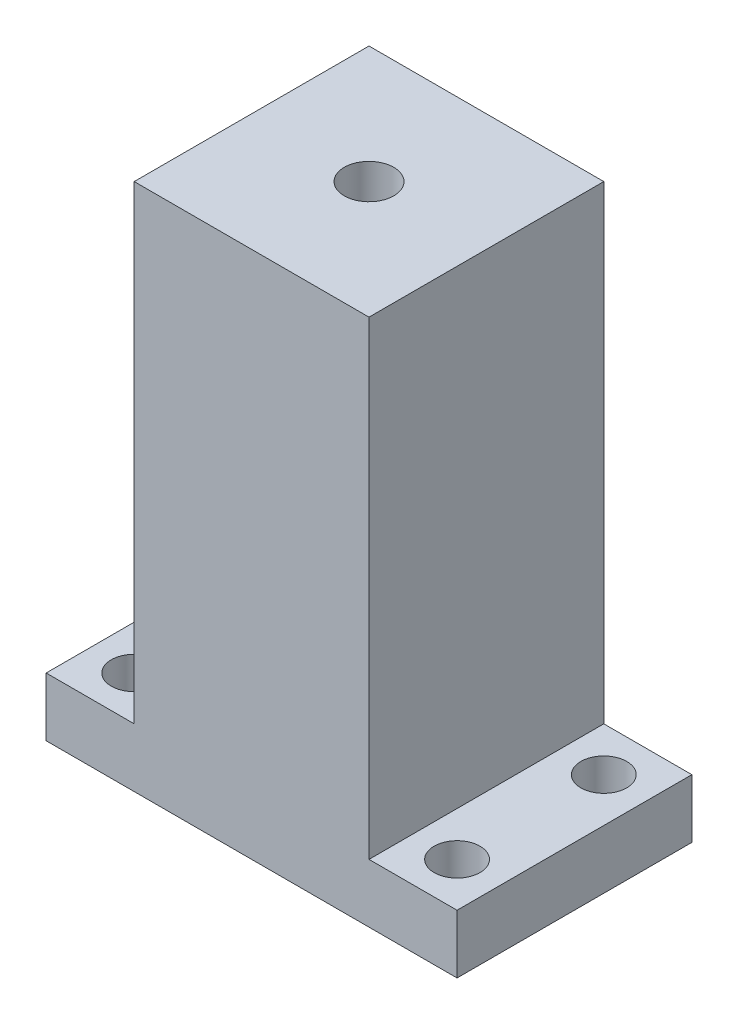
ISO-10303-21;
HEADER;
FILE_DESCRIPTION(('STEP AP214'),'2;1');
FILE_NAME('part.step','',(''),(''),'','','');
FILE_SCHEMA(('AUTOMOTIVE_DESIGN { 1 0 10303 214 1 1 1 1 }'));
ENDSEC;
DATA;
#1=APPLICATION_CONTEXT('core data for automotive mechanical design processes');
#2=APPLICATION_PROTOCOL_DEFINITION('international standard','automotive_design',2000,#1);
#3=PRODUCT_CONTEXT('',#1,'mechanical');
#4=PRODUCT('Part','Part','',(#3));
#5=PRODUCT_RELATED_PRODUCT_CATEGORY('part','',(#4));
#6=PRODUCT_DEFINITION_FORMATION('','',#4);
#7=PRODUCT_DEFINITION_CONTEXT('part definition',#1,'design');
#8=PRODUCT_DEFINITION('design','',#6,#7);
#9=PRODUCT_DEFINITION_SHAPE('','',#8);
#10=(LENGTH_UNIT() NAMED_UNIT(*) SI_UNIT(.MILLI.,.METRE.));
#11=(NAMED_UNIT(*) PLANE_ANGLE_UNIT() SI_UNIT($,.RADIAN.));
#12=(NAMED_UNIT(*) SI_UNIT($,.STERADIAN.) SOLID_ANGLE_UNIT());
#13=UNCERTAINTY_MEASURE_WITH_UNIT(LENGTH_MEASURE(1.E-05),#10,'distance_accuracy_value','');
#14=(GEOMETRIC_REPRESENTATION_CONTEXT(3) GLOBAL_UNCERTAINTY_ASSIGNED_CONTEXT((#13)) GLOBAL_UNIT_ASSIGNED_CONTEXT((#10,
#11,#12)) REPRESENTATION_CONTEXT('',''));
#15=CARTESIAN_POINT('',(0.,0.,0.));
#16=DIRECTION('',(0.,0.,1.));
#17=DIRECTION('',(1.,0.,0.));
#18=AXIS2_PLACEMENT_3D('',#15,#16,#17);
#19=CARTESIAN_POINT('',(44.45,114.3,25.4));
#20=DIRECTION('',(-1.,0.,0.));
#21=DIRECTION('',(0.,0.,1.));
#22=AXIS2_PLACEMENT_3D('',#19,#20,#21);
#23=PLANE('',#22);
#24=DIRECTION('',(0.,0.,-1.));
#25=VECTOR('',#24,1.);
#26=CARTESIAN_POINT('',(44.45,12.7,25.4));
#27=LINE('',#26,#25);
#28=CARTESIAN_POINT('',(44.45,12.7,25.4));
#29=VERTEX_POINT('',#28);
#30=CARTESIAN_POINT('',(44.45,12.7,-25.4));
#31=VERTEX_POINT('',#30);
#32=EDGE_CURVE('E103',#29,#31,#27,.T.);
#33=ORIENTED_EDGE('',*,*,#32,.F.);
#34=DIRECTION('',(0.,-1.,0.));
#35=VECTOR('',#34,1.);
#36=CARTESIAN_POINT('',(44.45,114.3,25.4));
#37=LINE('',#36,#35);
#38=CARTESIAN_POINT('',(44.45,0.,25.4));
#39=VERTEX_POINT('',#38);
#40=EDGE_CURVE('E133',#29,#39,#37,.T.);
#41=ORIENTED_EDGE('',*,*,#40,.T.);
#42=DIRECTION('',(0.,0.,-1.));
#43=VECTOR('',#42,1.);
#44=CARTESIAN_POINT('',(44.45,0.,25.4));
#45=LINE('',#44,#43);
#46=CARTESIAN_POINT('',(44.45,0.,-25.4));
#47=VERTEX_POINT('',#46);
#48=EDGE_CURVE('E134',#39,#47,#45,.T.);
#49=ORIENTED_EDGE('',*,*,#48,.T.);
#50=DIRECTION('',(0.,-1.,0.));
#51=VECTOR('',#50,1.);
#52=CARTESIAN_POINT('',(44.45,114.3,-25.4));
#53=LINE('',#52,#51);
#54=EDGE_CURVE('E149',#31,#47,#53,.T.);
#55=ORIENTED_EDGE('',*,*,#54,.F.);
#56=EDGE_LOOP('',(#33,#41,#49,#55));
#57=FACE_BOUND('',#56,.T.);
#58=ADVANCED_FACE('F33',(#57),#23,.F.);
#59=CARTESIAN_POINT('',(-44.45,114.3,-25.4));
#60=DIRECTION('',(0.,0.,1.));
#61=DIRECTION('',(1.,0.,0.));
#62=AXIS2_PLACEMENT_3D('',#59,#60,#61);
#63=PLANE('',#62);
#64=DIRECTION('',(0.,1.,0.));
#65=VECTOR('',#64,1.);
#66=CARTESIAN_POINT('',(25.4,12.7,-25.4));
#67=LINE('',#66,#65);
#68=CARTESIAN_POINT('',(25.4,12.7,-25.4));
#69=VERTEX_POINT('',#68);
#70=CARTESIAN_POINT('',(25.4,114.3,-25.4));
#71=VERTEX_POINT('',#70);
#72=EDGE_CURVE('E55',#69,#71,#67,.T.);
#73=ORIENTED_EDGE('',*,*,#72,.F.);
#74=DIRECTION('',(-1.,0.,0.));
#75=VECTOR('',#74,1.);
#76=CARTESIAN_POINT('',(-44.45,12.7,-25.4));
#77=LINE('',#76,#75);
#78=EDGE_CURVE('E98',#31,#69,#77,.T.);
#79=ORIENTED_EDGE('',*,*,#78,.F.);
#80=ORIENTED_EDGE('',*,*,#54,.T.);
#81=DIRECTION('',(-1.,0.,0.));
#82=VECTOR('',#81,1.);
#83=CARTESIAN_POINT('',(-44.45,0.,-25.4));
#84=LINE('',#83,#82);
#85=CARTESIAN_POINT('',(-44.45,0.,-25.4));
#86=VERTEX_POINT('',#85);
#87=EDGE_CURVE('E137',#47,#86,#84,.T.);
#88=ORIENTED_EDGE('',*,*,#87,.T.);
#89=DIRECTION('',(0.,-1.,0.));
#90=VECTOR('',#89,1.);
#91=CARTESIAN_POINT('',(-44.45,114.3,-25.4));
#92=LINE('',#91,#90);
#93=CARTESIAN_POINT('',(-44.45,12.7,-25.4));
#94=VERTEX_POINT('',#93);
#95=EDGE_CURVE('E148',#94,#86,#92,.T.);
#96=ORIENTED_EDGE('',*,*,#95,.F.);
#97=CARTESIAN_POINT('',(-25.4,12.7,-25.4));
#98=VERTEX_POINT('',#97);
#99=EDGE_CURVE('E108',#98,#94,#77,.T.);
#100=ORIENTED_EDGE('',*,*,#99,.F.);
#101=DIRECTION('',(0.,1.,0.));
#102=VECTOR('',#101,1.);
#103=CARTESIAN_POINT('',(-25.4,12.7,-25.4));
#104=LINE('',#103,#102);
#105=CARTESIAN_POINT('',(-25.4,114.3,-25.4));
#106=VERTEX_POINT('',#105);
#107=EDGE_CURVE('E120',#98,#106,#104,.T.);
#108=ORIENTED_EDGE('',*,*,#107,.T.);
#109=DIRECTION('',(-1.,0.,0.));
#110=VECTOR('',#109,1.);
#111=CARTESIAN_POINT('',(-44.45,114.3,-25.4));
#112=LINE('',#111,#110);
#113=EDGE_CURVE('E119',#71,#106,#112,.T.);
#114=ORIENTED_EDGE('',*,*,#113,.F.);
#115=EDGE_LOOP('',(#73,#79,#80,#88,#96,#100,#108,#114));
#116=FACE_BOUND('',#115,.T.);
#117=ADVANCED_FACE('F116',(#116),#63,.F.);
#118=CARTESIAN_POINT('',(-44.45,114.3,25.4));
#119=DIRECTION('',(1.,0.,0.));
#120=DIRECTION('',(0.,0.,-1.));
#121=AXIS2_PLACEMENT_3D('',#118,#119,#120);
#122=PLANE('',#121);
#123=DIRECTION('',(0.,0.,1.));
#124=VECTOR('',#123,1.);
#125=CARTESIAN_POINT('',(-44.45,12.7,25.4));
#126=LINE('',#125,#124);
#127=CARTESIAN_POINT('',(-44.45,12.7,25.4));
#128=VERTEX_POINT('',#127);
#129=EDGE_CURVE('E106',#94,#128,#126,.T.);
#130=ORIENTED_EDGE('',*,*,#129,.F.);
#131=ORIENTED_EDGE('',*,*,#95,.T.);
#132=DIRECTION('',(0.,0.,1.));
#133=VECTOR('',#132,1.);
#134=CARTESIAN_POINT('',(-44.45,0.,25.4));
#135=LINE('',#134,#133);
#136=CARTESIAN_POINT('',(-44.45,0.,25.4));
#137=VERTEX_POINT('',#136);
#138=EDGE_CURVE('E140',#86,#137,#135,.T.);
#139=ORIENTED_EDGE('',*,*,#138,.T.);
#140=DIRECTION('',(0.,-1.,0.));
#141=VECTOR('',#140,1.);
#142=CARTESIAN_POINT('',(-44.45,114.3,25.4));
#143=LINE('',#142,#141);
#144=EDGE_CURVE('E146',#128,#137,#143,.T.);
#145=ORIENTED_EDGE('',*,*,#144,.F.);
#146=EDGE_LOOP('',(#130,#131,#139,#145));
#147=FACE_BOUND('',#146,.T.);
#148=ADVANCED_FACE('F166',(#147),#122,.F.);
#149=CARTESIAN_POINT('',(-44.45,114.3,25.4));
#150=DIRECTION('',(0.,0.,-1.));
#151=DIRECTION('',(-1.,0.,0.));
#152=AXIS2_PLACEMENT_3D('',#149,#150,#151);
#153=PLANE('',#152);
#154=DIRECTION('',(0.,1.,0.));
#155=VECTOR('',#154,1.);
#156=CARTESIAN_POINT('',(25.4,12.7,25.4));
#157=LINE('',#156,#155);
#158=CARTESIAN_POINT('',(25.4,12.7,25.4));
#159=VERTEX_POINT('',#158);
#160=CARTESIAN_POINT('',(25.4,114.3,25.4));
#161=VERTEX_POINT('',#160);
#162=EDGE_CURVE('E111',#159,#161,#157,.T.);
#163=ORIENTED_EDGE('',*,*,#162,.T.);
#164=DIRECTION('',(1.,0.,0.));
#165=VECTOR('',#164,1.);
#166=CARTESIAN_POINT('',(-44.45,114.3,25.4));
#167=LINE('',#166,#165);
#168=CARTESIAN_POINT('',(-25.4,114.3,25.4));
#169=VERTEX_POINT('',#168);
#170=EDGE_CURVE('E129',#169,#161,#167,.T.);
#171=ORIENTED_EDGE('',*,*,#170,.F.);
#172=DIRECTION('',(0.,1.,0.));
#173=VECTOR('',#172,1.);
#174=CARTESIAN_POINT('',(-25.4,12.7,25.4));
#175=LINE('',#174,#173);
#176=CARTESIAN_POINT('',(-25.4,12.7,25.4));
#177=VERTEX_POINT('',#176);
#178=EDGE_CURVE('E47',#177,#169,#175,.T.);
#179=ORIENTED_EDGE('',*,*,#178,.F.);
#180=DIRECTION('',(1.,0.,0.));
#181=VECTOR('',#180,1.);
#182=CARTESIAN_POINT('',(-44.45,12.7,25.4));
#183=LINE('',#182,#181);
#184=EDGE_CURVE('E12',#128,#177,#183,.T.);
#185=ORIENTED_EDGE('',*,*,#184,.F.);
#186=ORIENTED_EDGE('',*,*,#144,.T.);
#187=DIRECTION('',(1.,0.,0.));
#188=VECTOR('',#187,1.);
#189=CARTESIAN_POINT('',(-44.45,0.,25.4));
#190=LINE('',#189,#188);
#191=EDGE_CURVE('E130',#137,#39,#190,.T.);
#192=ORIENTED_EDGE('',*,*,#191,.T.);
#193=ORIENTED_EDGE('',*,*,#40,.F.);
#194=EDGE_CURVE('E40',#159,#29,#183,.T.);
#195=ORIENTED_EDGE('',*,*,#194,.F.);
#196=EDGE_LOOP('',(#163,#171,#179,#185,#186,#192,#193,#195));
#197=FACE_BOUND('',#196,.T.);
#198=ADVANCED_FACE('F154',(#197),#153,.F.);
#199=CARTESIAN_POINT('',(0.,114.3,0.));
#200=DIRECTION('',(0.,-1.,0.));
#201=DIRECTION('',(0.,0.,-1.));
#202=AXIS2_PLACEMENT_3D('',#199,#200,#201);
#203=PLANE('',#202);
#204=CARTESIAN_POINT('',(0.,114.3,0.));
#205=DIRECTION('',(0.,1.,0.));
#206=DIRECTION('',(0.,0.,1.));
#207=AXIS2_PLACEMENT_3D('',#204,#205,#206);
#208=CIRCLE('',#207,5.3578125);
#209=CARTESIAN_POINT('',(0.,114.3,5.3578125));
#210=VERTEX_POINT('',#209);
#211=EDGE_CURVE('E200',#210,#210,#208,.T.);
#212=ORIENTED_EDGE('',*,*,#211,.F.);
#213=EDGE_LOOP('',(#212));
#214=FACE_BOUND('',#213,.T.);
#215=DIRECTION('',(0.,0.,-1.));
#216=VECTOR('',#215,1.);
#217=CARTESIAN_POINT('',(25.4,114.3,25.4));
#218=LINE('',#217,#216);
#219=EDGE_CURVE('E173',#161,#71,#218,.T.);
#220=ORIENTED_EDGE('',*,*,#219,.T.);
#221=ORIENTED_EDGE('',*,*,#113,.T.);
#222=DIRECTION('',(0.,0.,1.));
#223=VECTOR('',#222,1.);
#224=CARTESIAN_POINT('',(-25.4,114.3,25.4));
#225=LINE('',#224,#223);
#226=EDGE_CURVE('E113',#106,#169,#225,.T.);
#227=ORIENTED_EDGE('',*,*,#226,.T.);
#228=ORIENTED_EDGE('',*,*,#170,.T.);
#229=EDGE_LOOP('',(#220,#221,#227,#228));
#230=FACE_BOUND('',#229,.T.);
#231=ADVANCED_FACE('F224',(#214,#230),#203,.F.);
#232=CARTESIAN_POINT('',(0.,0.,0.));
#233=DIRECTION('',(0.,-1.,0.));
#234=DIRECTION('',(0.,0.,-1.));
#235=AXIS2_PLACEMENT_3D('',#232,#233,#234);
#236=PLANE('',#235);
#237=CARTESIAN_POINT('',(0.,0.,0.));
#238=DIRECTION('',(0.,-1.,0.));
#239=DIRECTION('',(0.,0.,-1.));
#240=AXIS2_PLACEMENT_3D('',#237,#238,#239);
#241=CIRCLE('',#240,2.54);
#242=CARTESIAN_POINT('',(0.,0.,-2.54));
#243=VERTEX_POINT('',#242);
#244=EDGE_CURVE('E206',#243,#243,#241,.T.);
#245=ORIENTED_EDGE('',*,*,#244,.F.);
#246=EDGE_LOOP('',(#245));
#247=FACE_BOUND('',#246,.T.);
#248=CARTESIAN_POINT('',(34.925,0.,-15.875));
#249=DIRECTION('',(0.,1.,0.));
#250=DIRECTION('',(0.,0.,1.));
#251=AXIS2_PLACEMENT_3D('',#248,#249,#250);
#252=CIRCLE('',#251,4.9609375);
#253=CARTESIAN_POINT('',(34.925,0.,-10.9140625));
#254=VERTEX_POINT('',#253);
#255=EDGE_CURVE('E191',#254,#254,#252,.T.);
#256=ORIENTED_EDGE('',*,*,#255,.T.);
#257=EDGE_LOOP('',(#256));
#258=FACE_BOUND('',#257,.T.);
#259=CARTESIAN_POINT('',(34.925,0.,15.875));
#260=DIRECTION('',(0.,1.,0.));
#261=DIRECTION('',(0.,0.,1.));
#262=AXIS2_PLACEMENT_3D('',#259,#260,#261);
#263=CIRCLE('',#262,4.9609375);
#264=CARTESIAN_POINT('',(34.925,0.,20.8359375));
#265=VERTEX_POINT('',#264);
#266=EDGE_CURVE('E185',#265,#265,#263,.T.);
#267=ORIENTED_EDGE('',*,*,#266,.T.);
#268=EDGE_LOOP('',(#267));
#269=FACE_BOUND('',#268,.T.);
#270=CARTESIAN_POINT('',(-34.925,0.,15.875));
#271=DIRECTION('',(0.,1.,0.));
#272=DIRECTION('',(0.,0.,1.));
#273=AXIS2_PLACEMENT_3D('',#270,#271,#272);
#274=CIRCLE('',#273,4.9609375);
#275=CARTESIAN_POINT('',(-34.925,0.,20.8359375));
#276=VERTEX_POINT('',#275);
#277=EDGE_CURVE('E179',#276,#276,#274,.T.);
#278=ORIENTED_EDGE('',*,*,#277,.T.);
#279=EDGE_LOOP('',(#278));
#280=FACE_BOUND('',#279,.T.);
#281=CARTESIAN_POINT('',(-34.925,0.,-15.875));
#282=DIRECTION('',(0.,1.,0.));
#283=DIRECTION('',(0.,0.,1.));
#284=AXIS2_PLACEMENT_3D('',#281,#282,#283);
#285=CIRCLE('',#284,4.9609375);
#286=CARTESIAN_POINT('',(-34.925,0.,-10.9140625));
#287=VERTEX_POINT('',#286);
#288=EDGE_CURVE('E174',#287,#287,#285,.T.);
#289=ORIENTED_EDGE('',*,*,#288,.T.);
#290=EDGE_LOOP('',(#289));
#291=FACE_BOUND('',#290,.T.);
#292=ORIENTED_EDGE('',*,*,#48,.F.);
#293=ORIENTED_EDGE('',*,*,#191,.F.);
#294=ORIENTED_EDGE('',*,*,#138,.F.);
#295=ORIENTED_EDGE('',*,*,#87,.F.);
#296=EDGE_LOOP('',(#292,#293,#294,#295));
#297=FACE_BOUND('',#296,.T.);
#298=ADVANCED_FACE('F161',(#247,#258,#269,#280,#291,#297),#236,.T.);
#299=CARTESIAN_POINT('',(-25.4,12.7,25.4));
#300=DIRECTION('',(-1.,0.,0.));
#301=DIRECTION('',(0.,0.,1.));
#302=AXIS2_PLACEMENT_3D('',#299,#300,#301);
#303=PLANE('',#302);
#304=ORIENTED_EDGE('',*,*,#226,.F.);
#305=ORIENTED_EDGE('',*,*,#107,.F.);
#306=DIRECTION('',(0.,0.,1.));
#307=VECTOR('',#306,1.);
#308=CARTESIAN_POINT('',(-25.4,12.7,25.4));
#309=LINE('',#308,#307);
#310=EDGE_CURVE('E112',#98,#177,#309,.T.);
#311=ORIENTED_EDGE('',*,*,#310,.T.);
#312=ORIENTED_EDGE('',*,*,#178,.T.);
#313=EDGE_LOOP('',(#304,#305,#311,#312));
#314=FACE_BOUND('',#313,.T.);
#315=ADVANCED_FACE('F223',(#314),#303,.T.);
#316=CARTESIAN_POINT('',(0.,12.7,0.));
#317=DIRECTION('',(0.,1.,0.));
#318=DIRECTION('',(0.,0.,1.));
#319=AXIS2_PLACEMENT_3D('',#316,#317,#318);
#320=PLANE('',#319);
#321=CARTESIAN_POINT('',(-34.925,12.7,15.875));
#322=DIRECTION('',(0.,1.,0.));
#323=DIRECTION('',(0.,0.,1.));
#324=AXIS2_PLACEMENT_3D('',#321,#322,#323);
#325=CIRCLE('',#324,4.9609375);
#326=CARTESIAN_POINT('',(-34.925,12.7,20.8359375));
#327=VERTEX_POINT('',#326);
#328=EDGE_CURVE('E182',#327,#327,#325,.T.);
#329=ORIENTED_EDGE('',*,*,#328,.F.);
#330=EDGE_LOOP('',(#329));
#331=FACE_BOUND('',#330,.T.);
#332=CARTESIAN_POINT('',(-34.925,12.7,-15.875));
#333=DIRECTION('',(0.,1.,0.));
#334=DIRECTION('',(0.,0.,1.));
#335=AXIS2_PLACEMENT_3D('',#332,#333,#334);
#336=CIRCLE('',#335,4.9609375);
#337=CARTESIAN_POINT('',(-34.925,12.7,-10.9140625));
#338=VERTEX_POINT('',#337);
#339=EDGE_CURVE('E176',#338,#338,#336,.T.);
#340=ORIENTED_EDGE('',*,*,#339,.F.);
#341=EDGE_LOOP('',(#340));
#342=FACE_BOUND('',#341,.T.);
#343=ORIENTED_EDGE('',*,*,#99,.T.);
#344=ORIENTED_EDGE('',*,*,#129,.T.);
#345=ORIENTED_EDGE('',*,*,#184,.T.);
#346=ORIENTED_EDGE('',*,*,#310,.F.);
#347=EDGE_LOOP('',(#343,#344,#345,#346));
#348=FACE_BOUND('',#347,.T.);
#349=ADVANCED_FACE('F168',(#331,#342,#348),#320,.T.);
#350=CARTESIAN_POINT('',(34.925,12.7,-15.875));
#351=DIRECTION('',(0.,1.,0.));
#352=DIRECTION('',(0.,0.,1.));
#353=AXIS2_PLACEMENT_3D('',#350,#351,#352);
#354=CIRCLE('',#353,4.9609375);
#355=CARTESIAN_POINT('',(34.925,12.7,-10.9140625));
#356=VERTEX_POINT('',#355);
#357=EDGE_CURVE('E194',#356,#356,#354,.T.);
#358=ORIENTED_EDGE('',*,*,#357,.F.);
#359=EDGE_LOOP('',(#358));
#360=FACE_BOUND('',#359,.T.);
#361=CARTESIAN_POINT('',(34.925,12.7,15.875));
#362=DIRECTION('',(0.,1.,0.));
#363=DIRECTION('',(0.,0.,1.));
#364=AXIS2_PLACEMENT_3D('',#361,#362,#363);
#365=CIRCLE('',#364,4.9609375);
#366=CARTESIAN_POINT('',(34.925,12.7,20.8359375));
#367=VERTEX_POINT('',#366);
#368=EDGE_CURVE('E188',#367,#367,#365,.T.);
#369=ORIENTED_EDGE('',*,*,#368,.F.);
#370=EDGE_LOOP('',(#369));
#371=FACE_BOUND('',#370,.T.);
#372=ORIENTED_EDGE('',*,*,#78,.T.);
#373=DIRECTION('',(0.,0.,-1.));
#374=VECTOR('',#373,1.);
#375=CARTESIAN_POINT('',(25.4,12.7,25.4));
#376=LINE('',#375,#374);
#377=EDGE_CURVE('E100',#159,#69,#376,.T.);
#378=ORIENTED_EDGE('',*,*,#377,.F.);
#379=ORIENTED_EDGE('',*,*,#194,.T.);
#380=ORIENTED_EDGE('',*,*,#32,.T.);
#381=EDGE_LOOP('',(#372,#378,#379,#380));
#382=FACE_BOUND('',#381,.T.);
#383=ADVANCED_FACE('F99',(#360,#371,#382),#320,.T.);
#384=CARTESIAN_POINT('',(25.4,12.7,25.4));
#385=DIRECTION('',(1.,0.,0.));
#386=DIRECTION('',(0.,0.,-1.));
#387=AXIS2_PLACEMENT_3D('',#384,#385,#386);
#388=PLANE('',#387);
#389=ORIENTED_EDGE('',*,*,#219,.F.);
#390=ORIENTED_EDGE('',*,*,#162,.F.);
#391=ORIENTED_EDGE('',*,*,#377,.T.);
#392=ORIENTED_EDGE('',*,*,#72,.T.);
#393=EDGE_LOOP('',(#389,#390,#391,#392));
#394=FACE_BOUND('',#393,.T.);
#395=ADVANCED_FACE('F109',(#394),#388,.T.);
#396=CARTESIAN_POINT('',(-34.925,0.,-15.875));
#397=DIRECTION('',(0.,1.,0.));
#398=DIRECTION('',(0.,0.,1.));
#399=AXIS2_PLACEMENT_3D('',#396,#397,#398);
#400=CYLINDRICAL_SURFACE('',#399,4.9609375);
#401=ORIENTED_EDGE('',*,*,#288,.F.);
#402=EDGE_LOOP('',(#401));
#403=FACE_BOUND('',#402,.T.);
#404=ORIENTED_EDGE('',*,*,#339,.T.);
#405=EDGE_LOOP('',(#404));
#406=FACE_BOUND('',#405,.T.);
#407=ADVANCED_FACE('F234',(#403,#406),#400,.F.);
#408=CARTESIAN_POINT('',(-34.925,0.,15.875));
#409=DIRECTION('',(0.,1.,0.));
#410=DIRECTION('',(0.,0.,1.));
#411=AXIS2_PLACEMENT_3D('',#408,#409,#410);
#412=CYLINDRICAL_SURFACE('',#411,4.9609375);
#413=ORIENTED_EDGE('',*,*,#277,.F.);
#414=EDGE_LOOP('',(#413));
#415=FACE_BOUND('',#414,.T.);
#416=ORIENTED_EDGE('',*,*,#328,.T.);
#417=EDGE_LOOP('',(#416));
#418=FACE_BOUND('',#417,.T.);
#419=ADVANCED_FACE('F237',(#415,#418),#412,.F.);
#420=CARTESIAN_POINT('',(34.925,0.,15.875));
#421=DIRECTION('',(0.,1.,0.));
#422=DIRECTION('',(0.,0.,1.));
#423=AXIS2_PLACEMENT_3D('',#420,#421,#422);
#424=CYLINDRICAL_SURFACE('',#423,4.9609375);
#425=ORIENTED_EDGE('',*,*,#266,.F.);
#426=EDGE_LOOP('',(#425));
#427=FACE_BOUND('',#426,.T.);
#428=ORIENTED_EDGE('',*,*,#368,.T.);
#429=EDGE_LOOP('',(#428));
#430=FACE_BOUND('',#429,.T.);
#431=ADVANCED_FACE('F282',(#427,#430),#424,.F.);
#432=CARTESIAN_POINT('',(34.925,0.,-15.875));
#433=DIRECTION('',(0.,1.,0.));
#434=DIRECTION('',(0.,0.,1.));
#435=AXIS2_PLACEMENT_3D('',#432,#433,#434);
#436=CYLINDRICAL_SURFACE('',#435,4.9609375);
#437=ORIENTED_EDGE('',*,*,#255,.F.);
#438=EDGE_LOOP('',(#437));
#439=FACE_BOUND('',#438,.T.);
#440=ORIENTED_EDGE('',*,*,#357,.T.);
#441=EDGE_LOOP('',(#440));
#442=FACE_BOUND('',#441,.T.);
#443=ADVANCED_FACE('F273',(#439,#442),#436,.F.);
#444=CARTESIAN_POINT('',(0.,73.025,0.));
#445=DIRECTION('',(0.,1.,0.));
#446=DIRECTION('',(0.,0.,1.));
#447=AXIS2_PLACEMENT_3D('',#444,#445,#446);
#448=CYLINDRICAL_SURFACE('',#447,5.3578125);
#449=CARTESIAN_POINT('',(0.,73.025,0.));
#450=DIRECTION('',(0.,1.,0.));
#451=DIRECTION('',(0.,0.,1.));
#452=AXIS2_PLACEMENT_3D('',#449,#450,#451);
#453=CIRCLE('',#452,5.3578125);
#454=CARTESIAN_POINT('',(0.,73.025,5.3578125));
#455=VERTEX_POINT('',#454);
#456=EDGE_CURVE('E197',#455,#455,#453,.T.);
#457=ORIENTED_EDGE('',*,*,#456,.F.);
#458=EDGE_LOOP('',(#457));
#459=FACE_BOUND('',#458,.T.);
#460=ORIENTED_EDGE('',*,*,#211,.T.);
#461=EDGE_LOOP('',(#460));
#462=FACE_BOUND('',#461,.T.);
#463=ADVANCED_FACE('F271',(#459,#462),#448,.F.);
#464=CARTESIAN_POINT('',(0.,73.025,0.));
#465=DIRECTION('',(0.,1.,0.));
#466=DIRECTION('',(0.,0.,1.));
#467=AXIS2_PLACEMENT_3D('',#464,#465,#466);
#468=PLANE('',#467);
#469=ORIENTED_EDGE('',*,*,#456,.T.);
#470=EDGE_LOOP('',(#469));
#471=FACE_BOUND('',#470,.T.);
#472=ADVANCED_FACE('F217',(#471),#468,.T.);
#473=CARTESIAN_POINT('',(0.,2.54,0.));
#474=DIRECTION('',(0.,-1.,0.));
#475=DIRECTION('',(0.,0.,-1.));
#476=AXIS2_PLACEMENT_3D('',#473,#474,#475);
#477=CYLINDRICAL_SURFACE('',#476,2.54);
#478=CARTESIAN_POINT('',(0.,2.54,0.));
#479=DIRECTION('',(0.,-1.,0.));
#480=DIRECTION('',(0.,0.,-1.));
#481=AXIS2_PLACEMENT_3D('',#478,#479,#480);
#482=CIRCLE('',#481,2.54);
#483=CARTESIAN_POINT('',(0.,2.54,-2.54));
#484=VERTEX_POINT('',#483);
#485=EDGE_CURVE('E203',#484,#484,#482,.T.);
#486=ORIENTED_EDGE('',*,*,#485,.F.);
#487=EDGE_LOOP('',(#486));
#488=FACE_BOUND('',#487,.T.);
#489=ORIENTED_EDGE('',*,*,#244,.T.);
#490=EDGE_LOOP('',(#489));
#491=FACE_BOUND('',#490,.T.);
#492=ADVANCED_FACE('F214',(#488,#491),#477,.F.);
#493=CARTESIAN_POINT('',(0.,2.54,0.));
#494=DIRECTION('',(0.,-1.,0.));
#495=DIRECTION('',(0.,0.,-1.));
#496=AXIS2_PLACEMENT_3D('',#493,#494,#495);
#497=PLANE('',#496);
#498=ORIENTED_EDGE('',*,*,#485,.T.);
#499=EDGE_LOOP('',(#498));
#500=FACE_BOUND('',#499,.T.);
#501=ADVANCED_FACE('F212',(#500),#497,.T.);
#502=CLOSED_SHELL('',(#58,#117,#148,#198,#231,#298,#315,#349,#383,#395,#407,#419,#431,#443,#463,
#472,#492,#501));
#503=MANIFOLD_SOLID_BREP('B2',#502);
#504=ADVANCED_BREP_SHAPE_REPRESENTATION('',(#18,#503),#14);
#505=SHAPE_DEFINITION_REPRESENTATION(#9,#504);
ENDSEC;
END-ISO-10303-21;
